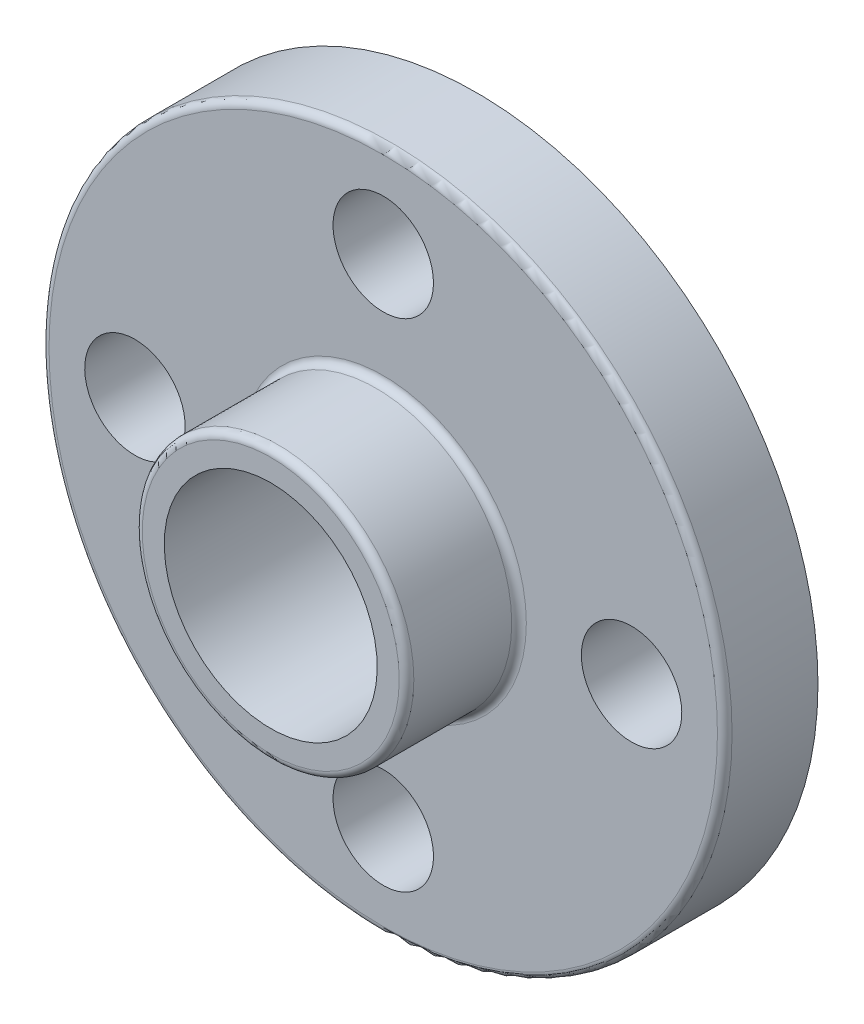
ISO-10303-21;
HEADER;
FILE_DESCRIPTION(('STEP AP214'),'2;1');
FILE_NAME('part.step','',(''),(''),'','','');
FILE_SCHEMA(('AUTOMOTIVE_DESIGN { 1 0 10303 214 1 1 1 1 }'));
ENDSEC;
DATA;
#1=APPLICATION_CONTEXT('core data for automotive mechanical design processes');
#2=APPLICATION_PROTOCOL_DEFINITION('international standard','automotive_design',2000,#1);
#3=PRODUCT_CONTEXT('',#1,'mechanical');
#4=PRODUCT('Part','Part','',(#3));
#5=PRODUCT_RELATED_PRODUCT_CATEGORY('part','',(#4));
#6=PRODUCT_DEFINITION_FORMATION('','',#4);
#7=PRODUCT_DEFINITION_CONTEXT('part definition',#1,'design');
#8=PRODUCT_DEFINITION('design','',#6,#7);
#9=PRODUCT_DEFINITION_SHAPE('','',#8);
#10=(LENGTH_UNIT() NAMED_UNIT(*) SI_UNIT(.MILLI.,.METRE.));
#11=(NAMED_UNIT(*) PLANE_ANGLE_UNIT() SI_UNIT($,.RADIAN.));
#12=(NAMED_UNIT(*) SI_UNIT($,.STERADIAN.) SOLID_ANGLE_UNIT());
#13=UNCERTAINTY_MEASURE_WITH_UNIT(LENGTH_MEASURE(1.E-05),#10,'distance_accuracy_value','');
#14=(GEOMETRIC_REPRESENTATION_CONTEXT(3) GLOBAL_UNCERTAINTY_ASSIGNED_CONTEXT((#13)) GLOBAL_UNIT_ASSIGNED_CONTEXT((#10,
#11,#12)) REPRESENTATION_CONTEXT('',''));
#15=CARTESIAN_POINT('',(0.,0.,0.));
#16=DIRECTION('',(0.,0.,1.));
#17=DIRECTION('',(1.,0.,0.));
#18=AXIS2_PLACEMENT_3D('',#15,#16,#17);
#19=CARTESIAN_POINT('',(0.,0.,14.732));
#20=DIRECTION('',(0.,0.,1.));
#21=DIRECTION('',(1.,0.,0.));
#22=AXIS2_PLACEMENT_3D('',#19,#20,#21);
#23=PLANE('',#22);
#24=CARTESIAN_POINT('',(0.,0.,14.732));
#25=DIRECTION('',(0.,0.,1.));
#26=DIRECTION('',(1.,0.,0.));
#27=AXIS2_PLACEMENT_3D('',#24,#25,#26);
#28=CIRCLE('',#27,22.6175454545454);
#29=CARTESIAN_POINT('',(22.6175454545454,0.,14.732));
#30=VERTEX_POINT('',#29);
#31=EDGE_CURVE('E42',#30,#30,#28,.F.);
#32=ORIENTED_EDGE('',*,*,#31,.T.);
#33=EDGE_LOOP('',(#32));
#34=FACE_BOUND('',#33,.T.);
#35=CARTESIAN_POINT('',(0.,0.,14.732));
#36=DIRECTION('',(0.,0.,1.));
#37=DIRECTION('',(1.,0.,0.));
#38=AXIS2_PLACEMENT_3D('',#35,#36,#37);
#39=CIRCLE('',#38,52.8204545454545);
#40=CARTESIAN_POINT('',(52.8204545454545,0.,14.732));
#41=VERTEX_POINT('',#40);
#42=EDGE_CURVE('E46',#41,#41,#39,.T.);
#43=ORIENTED_EDGE('',*,*,#42,.T.);
#44=EDGE_LOOP('',(#43));
#45=FACE_BOUND('',#44,.T.);
#46=CARTESIAN_POINT('',(39.243,4.11048606540663E-13,14.732));
#47=DIRECTION('',(0.,0.,1.));
#48=DIRECTION('',(0.,-1.,0.));
#49=AXIS2_PLACEMENT_3D('',#46,#47,#48);
#50=CIRCLE('',#49,7.9375);
#51=CARTESIAN_POINT('',(39.2430000000001,-7.93749999999959,14.732));
#52=VERTEX_POINT('',#51);
#53=EDGE_CURVE('E83',#52,#52,#50,.T.);
#54=ORIENTED_EDGE('',*,*,#53,.F.);
#55=EDGE_LOOP('',(#54));
#56=FACE_BOUND('',#55,.T.);
#57=CARTESIAN_POINT('',(2.74032404360442E-13,-39.243,14.732));
#58=DIRECTION('',(0.,0.,1.));
#59=DIRECTION('',(-1.,0.,0.));
#60=AXIS2_PLACEMENT_3D('',#57,#58,#59);
#61=CIRCLE('',#60,7.9375);
#62=CARTESIAN_POINT('',(-7.93749999999973,-39.2430000000001,14.732));
#63=VERTEX_POINT('',#62);
#64=EDGE_CURVE('E77',#63,#63,#61,.T.);
#65=ORIENTED_EDGE('',*,*,#64,.F.);
#66=EDGE_LOOP('',(#65));
#67=FACE_BOUND('',#66,.T.);
#68=CARTESIAN_POINT('',(-39.243,-1.37016202180221E-13,14.732));
#69=DIRECTION('',(0.,0.,1.));
#70=DIRECTION('',(0.,1.,0.));
#71=AXIS2_PLACEMENT_3D('',#68,#69,#70);
#72=CIRCLE('',#71,7.9375);
#73=CARTESIAN_POINT('',(-39.243,7.93749999999986,14.732));
#74=VERTEX_POINT('',#73);
#75=EDGE_CURVE('E71',#74,#74,#72,.T.);
#76=ORIENTED_EDGE('',*,*,#75,.F.);
#77=EDGE_LOOP('',(#76));
#78=FACE_BOUND('',#77,.T.);
#79=CARTESIAN_POINT('',(0.,39.243,14.732));
#80=DIRECTION('',(0.,0.,1.));
#81=DIRECTION('',(1.,0.,0.));
#82=AXIS2_PLACEMENT_3D('',#79,#80,#81);
#83=CIRCLE('',#82,7.9375);
#84=CARTESIAN_POINT('',(7.9375,39.243,14.732));
#85=VERTEX_POINT('',#84);
#86=EDGE_CURVE('E65',#85,#85,#83,.T.);
#87=ORIENTED_EDGE('',*,*,#86,.F.);
#88=EDGE_LOOP('',(#87));
#89=FACE_BOUND('',#88,.T.);
#90=ADVANCED_FACE('F35',(#34,#45,#56,#67,#78,#89),#23,.T.);
#91=CARTESIAN_POINT('',(0.,0.,14.732));
#92=DIRECTION('',(0.,0.,-1.));
#93=DIRECTION('',(-1.,0.,0.));
#94=AXIS2_PLACEMENT_3D('',#91,#92,#93);
#95=CYLINDRICAL_SURFACE('',#94,53.975);
#96=CARTESIAN_POINT('',(0.,0.,13.5774545454545));
#97=DIRECTION('',(0.,0.,1.));
#98=DIRECTION('',(1.,0.,0.));
#99=AXIS2_PLACEMENT_3D('',#96,#97,#98);
#100=CIRCLE('',#99,53.975);
#101=CARTESIAN_POINT('',(53.975,0.,13.5774545454545));
#102=VERTEX_POINT('',#101);
#103=EDGE_CURVE('E10',#102,#102,#100,.F.);
#104=ORIENTED_EDGE('',*,*,#103,.T.);
#105=EDGE_LOOP('',(#104));
#106=FACE_BOUND('',#105,.T.);
#107=CARTESIAN_POINT('',(0.,0.,0.));
#108=DIRECTION('',(0.,0.,1.));
#109=DIRECTION('',(1.,0.,0.));
#110=AXIS2_PLACEMENT_3D('',#107,#108,#109);
#111=CIRCLE('',#110,53.975);
#112=CARTESIAN_POINT('',(53.975,0.,0.));
#113=VERTEX_POINT('',#112);
#114=EDGE_CURVE('E61',#113,#113,#111,.T.);
#115=ORIENTED_EDGE('',*,*,#114,.T.);
#116=EDGE_LOOP('',(#115));
#117=FACE_BOUND('',#116,.T.);
#118=ADVANCED_FACE('F107',(#106,#117),#95,.T.);
#119=CARTESIAN_POINT('',(0.,0.,0.));
#120=DIRECTION('',(0.,0.,1.));
#121=DIRECTION('',(1.,0.,0.));
#122=AXIS2_PLACEMENT_3D('',#119,#120,#121);
#123=PLANE('',#122);
#124=CARTESIAN_POINT('',(0.,0.,0.));
#125=DIRECTION('',(0.,0.,-1.));
#126=DIRECTION('',(0.,1.,0.));
#127=AXIS2_PLACEMENT_3D('',#124,#125,#126);
#128=CIRCLE('',#127,12.1539);
#129=CARTESIAN_POINT('',(0.,12.1539,0.));
#130=VERTEX_POINT('',#129);
#131=EDGE_CURVE('E97',#130,#130,#128,.T.);
#132=ORIENTED_EDGE('',*,*,#131,.F.);
#133=EDGE_LOOP('',(#132));
#134=FACE_BOUND('',#133,.T.);
#135=CARTESIAN_POINT('',(39.243,4.11048606540663E-13,0.));
#136=DIRECTION('',(0.,0.,1.));
#137=DIRECTION('',(0.,-1.,0.));
#138=AXIS2_PLACEMENT_3D('',#135,#136,#137);
#139=CIRCLE('',#138,7.9375);
#140=CARTESIAN_POINT('',(39.2430000000001,-7.93749999999959,0.));
#141=VERTEX_POINT('',#140);
#142=EDGE_CURVE('E80',#141,#141,#139,.T.);
#143=ORIENTED_EDGE('',*,*,#142,.T.);
#144=EDGE_LOOP('',(#143));
#145=FACE_BOUND('',#144,.T.);
#146=CARTESIAN_POINT('',(2.74032404360442E-13,-39.243,0.));
#147=DIRECTION('',(0.,0.,1.));
#148=DIRECTION('',(-1.,0.,0.));
#149=AXIS2_PLACEMENT_3D('',#146,#147,#148);
#150=CIRCLE('',#149,7.9375);
#151=CARTESIAN_POINT('',(-7.93749999999973,-39.2430000000001,0.));
#152=VERTEX_POINT('',#151);
#153=EDGE_CURVE('E74',#152,#152,#150,.T.);
#154=ORIENTED_EDGE('',*,*,#153,.T.);
#155=EDGE_LOOP('',(#154));
#156=FACE_BOUND('',#155,.T.);
#157=CARTESIAN_POINT('',(-39.243,-1.37016202180221E-13,0.));
#158=DIRECTION('',(0.,0.,1.));
#159=DIRECTION('',(0.,1.,0.));
#160=AXIS2_PLACEMENT_3D('',#157,#158,#159);
#161=CIRCLE('',#160,7.9375);
#162=CARTESIAN_POINT('',(-39.243,7.93749999999986,0.));
#163=VERTEX_POINT('',#162);
#164=EDGE_CURVE('E68',#163,#163,#161,.T.);
#165=ORIENTED_EDGE('',*,*,#164,.T.);
#166=EDGE_LOOP('',(#165));
#167=FACE_BOUND('',#166,.T.);
#168=CARTESIAN_POINT('',(0.,39.243,0.));
#169=DIRECTION('',(0.,0.,1.));
#170=DIRECTION('',(1.,0.,0.));
#171=AXIS2_PLACEMENT_3D('',#168,#169,#170);
#172=CIRCLE('',#171,7.9375);
#173=CARTESIAN_POINT('',(7.9375,39.243,0.));
#174=VERTEX_POINT('',#173);
#175=EDGE_CURVE('E64',#174,#174,#172,.T.);
#176=ORIENTED_EDGE('',*,*,#175,.T.);
#177=EDGE_LOOP('',(#176));
#178=FACE_BOUND('',#177,.T.);
#179=ORIENTED_EDGE('',*,*,#114,.F.);
#180=EDGE_LOOP('',(#179));
#181=FACE_BOUND('',#180,.T.);
#182=ADVANCED_FACE('F103',(#134,#145,#156,#167,#178,#181),#123,.F.);
#183=CARTESIAN_POINT('',(0.,0.,32.512));
#184=DIRECTION('',(0.,0.,-1.));
#185=DIRECTION('',(-1.,0.,0.));
#186=AXIS2_PLACEMENT_3D('',#183,#184,#185);
#187=CYLINDRICAL_SURFACE('',#186,21.463);
#188=CARTESIAN_POINT('',(0.,0.,31.3574545454545));
#189=DIRECTION('',(0.,0.,1.));
#190=DIRECTION('',(1.,0.,0.));
#191=AXIS2_PLACEMENT_3D('',#188,#189,#190);
#192=CIRCLE('',#191,21.463);
#193=CARTESIAN_POINT('',(-21.463,0.,31.3574545454545));
#194=VERTEX_POINT('',#193);
#195=EDGE_CURVE('E50',#194,#194,#192,.F.);
#196=CARTESIAN_POINT('',(0.,0.,15.8865454545455));
#197=DIRECTION('',(0.,0.,1.));
#198=DIRECTION('',(1.,0.,0.));
#199=AXIS2_PLACEMENT_3D('',#196,#197,#198);
#200=CIRCLE('',#199,21.463);
#201=CARTESIAN_POINT('',(-21.463,0.,15.8865454545454));
#202=VERTEX_POINT('',#201);
#203=EDGE_CURVE('E55',#202,#202,#200,.T.);
#204=CARTESIAN_POINT('',(-21.463,0.,31.3574545454545));
#205=CARTESIAN_POINT('',(-21.463,0.,31.1962992424242));
#206=CARTESIAN_POINT('',(-21.463,0.,31.0351439393939));
#207=CARTESIAN_POINT('',(-21.463,0.,30.7128333333333));
#208=CARTESIAN_POINT('',(-21.463,0.,30.551678030303));
#209=CARTESIAN_POINT('',(-21.463,0.,30.2293674242424));
#210=CARTESIAN_POINT('',(-21.463,0.,30.0682121212121));
#211=CARTESIAN_POINT('',(-21.463,0.,29.7459015151515));
#212=CARTESIAN_POINT('',(-21.463,0.,29.5847462121212));
#213=CARTESIAN_POINT('',(-21.463,0.,29.2624356060606));
#214=CARTESIAN_POINT('',(-21.463,0.,29.1012803030303));
#215=CARTESIAN_POINT('',(-21.463,0.,28.7789696969697));
#216=CARTESIAN_POINT('',(-21.463,0.,28.6178143939394));
#217=CARTESIAN_POINT('',(-21.463,0.,28.2955037878788));
#218=CARTESIAN_POINT('',(-21.463,0.,28.1343484848485));
#219=CARTESIAN_POINT('',(-21.463,0.,27.8120378787879));
#220=CARTESIAN_POINT('',(-21.463,0.,27.6508825757576));
#221=CARTESIAN_POINT('',(-21.463,0.,27.328571969697));
#222=CARTESIAN_POINT('',(-21.463,0.,27.1674166666667));
#223=CARTESIAN_POINT('',(-21.463,0.,26.8451060606061));
#224=CARTESIAN_POINT('',(-21.463,0.,26.6839507575758));
#225=CARTESIAN_POINT('',(-21.463,0.,26.3616401515151));
#226=CARTESIAN_POINT('',(-21.463,0.,26.2004848484848));
#227=CARTESIAN_POINT('',(-21.463,0.,25.8781742424242));
#228=CARTESIAN_POINT('',(-21.463,0.,25.7170189393939));
#229=CARTESIAN_POINT('',(-21.463,0.,25.3947083333333));
#230=CARTESIAN_POINT('',(-21.463,0.,25.233553030303));
#231=CARTESIAN_POINT('',(-21.463,0.,24.9112424242424));
#232=CARTESIAN_POINT('',(-21.463,0.,24.7500871212121));
#233=CARTESIAN_POINT('',(-21.463,0.,24.4277765151515));
#234=CARTESIAN_POINT('',(-21.463,0.,24.2666212121212));
#235=CARTESIAN_POINT('',(-21.463,0.,23.9443106060606));
#236=CARTESIAN_POINT('',(-21.463,0.,23.7831553030303));
#237=CARTESIAN_POINT('',(-21.463,0.,23.4608446969697));
#238=CARTESIAN_POINT('',(-21.463,0.,23.2996893939394));
#239=CARTESIAN_POINT('',(-21.463,0.,22.9773787878788));
#240=CARTESIAN_POINT('',(-21.463,0.,22.8162234848485));
#241=CARTESIAN_POINT('',(-21.463,0.,22.4939128787879));
#242=CARTESIAN_POINT('',(-21.463,0.,22.3327575757576));
#243=CARTESIAN_POINT('',(-21.463,0.,22.010446969697));
#244=CARTESIAN_POINT('',(-21.463,0.,21.8492916666667));
#245=CARTESIAN_POINT('',(-21.463,0.,21.5269810606061));
#246=CARTESIAN_POINT('',(-21.463,0.,21.3658257575757));
#247=CARTESIAN_POINT('',(-21.463,0.,21.0435151515151));
#248=CARTESIAN_POINT('',(-21.463,0.,20.8823598484848));
#249=CARTESIAN_POINT('',(-21.463,0.,20.5600492424242));
#250=CARTESIAN_POINT('',(-21.463,0.,20.3988939393939));
#251=CARTESIAN_POINT('',(-21.463,0.,20.0765833333333));
#252=CARTESIAN_POINT('',(-21.463,0.,19.915428030303));
#253=CARTESIAN_POINT('',(-21.463,0.,19.5931174242424));
#254=CARTESIAN_POINT('',(-21.463,0.,19.4319621212121));
#255=CARTESIAN_POINT('',(-21.463,0.,19.1096515151515));
#256=CARTESIAN_POINT('',(-21.463,0.,18.9484962121212));
#257=CARTESIAN_POINT('',(-21.463,0.,18.6261856060606));
#258=CARTESIAN_POINT('',(-21.463,0.,18.4650303030303));
#259=CARTESIAN_POINT('',(-21.463,0.,18.1427196969697));
#260=CARTESIAN_POINT('',(-21.463,0.,17.9815643939394));
#261=CARTESIAN_POINT('',(-21.463,0.,17.6592537878788));
#262=CARTESIAN_POINT('',(-21.463,0.,17.4980984848485));
#263=CARTESIAN_POINT('',(-21.463,0.,17.1757878787879));
#264=CARTESIAN_POINT('',(-21.463,0.,17.0146325757576));
#265=CARTESIAN_POINT('',(-21.463,0.,16.692321969697));
#266=CARTESIAN_POINT('',(-21.463,0.,16.5311666666667));
#267=CARTESIAN_POINT('',(-21.463,0.,16.2088560606061));
#268=CARTESIAN_POINT('',(-21.463,0.,16.0477007575758));
#269=CARTESIAN_POINT('',(-21.463,0.,15.8865454545454));
#270=B_SPLINE_CURVE_WITH_KNOTS('',3,(#204,#205,#206,#207,#208,#209,#210,#211,#212,#213,#214,
#215,#216,#217,#218,#219,#220,#221,#222,#223,#224,#225,#226,#227,#228,#229,#230,#231,#232,#233,
#234,#235,#236,#237,#238,#239,#240,#241,#242,#243,#244,#245,#246,#247,#248,#249,#250,#251,#252,
#253,#254,#255,#256,#257,#258,#259,#260,#261,#262,#263,#264,#265,#266,#267,#268,#269),
.UNSPECIFIED.,.F.,.F.,(4,2,2,2,2,2,2,2,2,2,2,2,2,2,2,2,2,2,2,2,2,2,2,2,2,2,2,2,2,2,2,2,4),(0.,
0.483465909090913,0.966931818181822,1.45039772727273,1.93386363636364,2.41732954545455,
2.90079545454546,3.38426136363637,3.86772727272728,4.35119318181818,4.83465909090909,5.318125,
5.80159090909091,6.28505681818182,6.76852272727273,7.25198863636364,7.73545454545455,
8.21892045454546,8.70238636363637,9.18585227272728,9.66931818181819,10.1527840909091,10.63625,
11.1197159090909,11.6031818181818,12.0866477272727,12.5701136363636,13.0535795454546,
13.5370454545455,14.0205113636364,14.5039772727273,14.9874431818182,15.4709090909091),.UNSPECIFIED.);
#271=EDGE_CURVE('BSEAM106',#194,#202,#270,.T.);
#272=ORIENTED_EDGE('',*,*,#195,.T.);
#273=ORIENTED_EDGE('',*,*,#203,.T.);
#274=ORIENTED_EDGE('',*,*,#271,.T.);
#275=ORIENTED_EDGE('',*,*,#271,.F.);
#276=EDGE_LOOP('',(#272,#274,#273,#275));
#277=FACE_BOUND('',#276,.T.);
#278=ADVANCED_FACE('F106',(#277),#187,.T.);
#279=CARTESIAN_POINT('',(0.,0.,32.512));
#280=DIRECTION('',(0.,0.,1.));
#281=DIRECTION('',(1.,0.,0.));
#282=AXIS2_PLACEMENT_3D('',#279,#280,#281);
#283=PLANE('',#282);
#284=CARTESIAN_POINT('',(0.,0.,32.512));
#285=DIRECTION('',(0.,0.,-1.));
#286=DIRECTION('',(0.,1.,0.));
#287=AXIS2_PLACEMENT_3D('',#284,#285,#286);
#288=CIRCLE('',#287,16.8275);
#289=CARTESIAN_POINT('',(0.,16.8275,32.512));
#290=VERTEX_POINT('',#289);
#291=EDGE_CURVE('E86',#290,#290,#288,.T.);
#292=ORIENTED_EDGE('',*,*,#291,.T.);
#293=EDGE_LOOP('',(#292));
#294=FACE_BOUND('',#293,.T.);
#295=CARTESIAN_POINT('',(0.,0.,32.512));
#296=DIRECTION('',(0.,0.,1.));
#297=DIRECTION('',(1.,0.,0.));
#298=AXIS2_PLACEMENT_3D('',#295,#296,#297);
#299=CIRCLE('',#298,20.3084545454545);
#300=CARTESIAN_POINT('',(20.3084545454545,0.,32.512));
#301=VERTEX_POINT('',#300);
#302=EDGE_CURVE('E58',#301,#301,#299,.T.);
#303=ORIENTED_EDGE('',*,*,#302,.T.);
#304=EDGE_LOOP('',(#303));
#305=FACE_BOUND('',#304,.T.);
#306=ADVANCED_FACE('F142',(#294,#305),#283,.T.);
#307=CARTESIAN_POINT('',(0.,39.243,0.));
#308=DIRECTION('',(0.,0.,1.));
#309=DIRECTION('',(1.,0.,0.));
#310=AXIS2_PLACEMENT_3D('',#307,#308,#309);
#311=CYLINDRICAL_SURFACE('',#310,7.9375);
#312=ORIENTED_EDGE('',*,*,#175,.F.);
#313=EDGE_LOOP('',(#312));
#314=FACE_BOUND('',#313,.T.);
#315=ORIENTED_EDGE('',*,*,#86,.T.);
#316=EDGE_LOOP('',(#315));
#317=FACE_BOUND('',#316,.T.);
#318=ADVANCED_FACE('F148',(#314,#317),#311,.F.);
#319=CARTESIAN_POINT('',(-39.243,-1.37016202180221E-13,0.));
#320=DIRECTION('',(0.,0.,1.));
#321=DIRECTION('',(1.,0.,0.));
#322=AXIS2_PLACEMENT_3D('',#319,#320,#321);
#323=CYLINDRICAL_SURFACE('',#322,7.9375);
#324=ORIENTED_EDGE('',*,*,#164,.F.);
#325=EDGE_LOOP('',(#324));
#326=FACE_BOUND('',#325,.T.);
#327=ORIENTED_EDGE('',*,*,#75,.T.);
#328=EDGE_LOOP('',(#327));
#329=FACE_BOUND('',#328,.T.);
#330=ADVANCED_FACE('F154',(#326,#329),#323,.F.);
#331=CARTESIAN_POINT('',(2.74032404360442E-13,-39.243,0.));
#332=DIRECTION('',(0.,0.,1.));
#333=DIRECTION('',(1.,0.,0.));
#334=AXIS2_PLACEMENT_3D('',#331,#332,#333);
#335=CYLINDRICAL_SURFACE('',#334,7.9375);
#336=ORIENTED_EDGE('',*,*,#153,.F.);
#337=EDGE_LOOP('',(#336));
#338=FACE_BOUND('',#337,.T.);
#339=ORIENTED_EDGE('',*,*,#64,.T.);
#340=EDGE_LOOP('',(#339));
#341=FACE_BOUND('',#340,.T.);
#342=ADVANCED_FACE('F158',(#338,#341),#335,.F.);
#343=CARTESIAN_POINT('',(39.243,4.11048606540663E-13,0.));
#344=DIRECTION('',(0.,0.,1.));
#345=DIRECTION('',(1.,0.,0.));
#346=AXIS2_PLACEMENT_3D('',#343,#344,#345);
#347=CYLINDRICAL_SURFACE('',#346,7.9375);
#348=ORIENTED_EDGE('',*,*,#142,.F.);
#349=EDGE_LOOP('',(#348));
#350=FACE_BOUND('',#349,.T.);
#351=ORIENTED_EDGE('',*,*,#53,.T.);
#352=EDGE_LOOP('',(#351));
#353=FACE_BOUND('',#352,.T.);
#354=ADVANCED_FACE('F129',(#350,#353),#347,.F.);
#355=CARTESIAN_POINT('',(0.,0.,31.3574545454545));
#356=DIRECTION('',(0.,0.,1.));
#357=DIRECTION('',(1.,0.,0.));
#358=AXIS2_PLACEMENT_3D('',#355,#356,#357);
#359=TOROIDAL_SURFACE('',#358,20.3084545454545,1.15454545454545);
#360=ORIENTED_EDGE('',*,*,#195,.F.);
#361=EDGE_LOOP('',(#360));
#362=FACE_BOUND('',#361,.T.);
#363=ORIENTED_EDGE('',*,*,#302,.F.);
#364=EDGE_LOOP('',(#363));
#365=FACE_BOUND('',#364,.T.);
#366=ADVANCED_FACE('F126',(#362,#365),#359,.T.);
#367=CARTESIAN_POINT('',(0.,0.,15.8865454545455));
#368=DIRECTION('',(0.,0.,1.));
#369=DIRECTION('',(1.,0.,0.));
#370=AXIS2_PLACEMENT_3D('',#367,#368,#369);
#371=TOROIDAL_SURFACE('',#370,22.6175454545454,1.15454545454545);
#372=ORIENTED_EDGE('',*,*,#31,.F.);
#373=EDGE_LOOP('',(#372));
#374=FACE_BOUND('',#373,.T.);
#375=ORIENTED_EDGE('',*,*,#203,.F.);
#376=EDGE_LOOP('',(#375));
#377=FACE_BOUND('',#376,.T.);
#378=ADVANCED_FACE('F128',(#374,#377),#371,.F.);
#379=CARTESIAN_POINT('',(0.,0.,13.5774545454545));
#380=DIRECTION('',(0.,0.,1.));
#381=DIRECTION('',(1.,0.,0.));
#382=AXIS2_PLACEMENT_3D('',#379,#380,#381);
#383=TOROIDAL_SURFACE('',#382,52.8204545454545,1.15454545454545);
#384=ORIENTED_EDGE('',*,*,#103,.F.);
#385=EDGE_LOOP('',(#384));
#386=FACE_BOUND('',#385,.T.);
#387=ORIENTED_EDGE('',*,*,#42,.F.);
#388=EDGE_LOOP('',(#387));
#389=FACE_BOUND('',#388,.T.);
#390=ADVANCED_FACE('F37',(#386,#389),#383,.T.);
#391=CARTESIAN_POINT('',(0.,0.,4.06399999999998));
#392=DIRECTION('',(0.,0.,1.));
#393=DIRECTION('',(0.,-1.,0.));
#394=AXIS2_PLACEMENT_3D('',#391,#392,#393);
#395=CONICAL_SURFACE('',#394,16.637,0.00669632848002418);
#396=ORIENTED_EDGE('',*,*,#291,.F.);
#397=EDGE_LOOP('',(#396));
#398=FACE_BOUND('',#397,.T.);
#399=CARTESIAN_POINT('',(0.,0.,4.06399999999998));
#400=DIRECTION('',(0.,0.,-1.));
#401=DIRECTION('',(0.,1.,0.));
#402=AXIS2_PLACEMENT_3D('',#399,#400,#401);
#403=CIRCLE('',#402,16.637);
#404=CARTESIAN_POINT('',(0.,16.637,4.06399999999998));
#405=VERTEX_POINT('',#404);
#406=EDGE_CURVE('E91',#405,#405,#403,.T.);
#407=ORIENTED_EDGE('',*,*,#406,.T.);
#408=EDGE_LOOP('',(#407));
#409=FACE_BOUND('',#408,.T.);
#410=ADVANCED_FACE('F136',(#398,#409),#395,.F.);
#411=CARTESIAN_POINT('',(0.,16.637,4.06399999999999));
#412=DIRECTION('',(0.,0.,-1.));
#413=DIRECTION('',(0.,1.,0.));
#414=AXIS2_PLACEMENT_3D('',#411,#412,#413);
#415=PLANE('',#414);
#416=ORIENTED_EDGE('',*,*,#406,.F.);
#417=EDGE_LOOP('',(#416));
#418=FACE_BOUND('',#417,.T.);
#419=CARTESIAN_POINT('',(0.,0.,4.064));
#420=DIRECTION('',(0.,0.,-1.));
#421=DIRECTION('',(0.,1.,0.));
#422=AXIS2_PLACEMENT_3D('',#419,#420,#421);
#423=CIRCLE('',#422,12.1539);
#424=CARTESIAN_POINT('',(0.,12.1539,4.064));
#425=VERTEX_POINT('',#424);
#426=EDGE_CURVE('E94',#425,#425,#423,.T.);
#427=ORIENTED_EDGE('',*,*,#426,.T.);
#428=EDGE_LOOP('',(#427));
#429=FACE_BOUND('',#428,.T.);
#430=ADVANCED_FACE('F168',(#418,#429),#415,.F.);
#431=CARTESIAN_POINT('',(0.,0.,0.));
#432=DIRECTION('',(0.,0.,-1.));
#433=DIRECTION('',(0.,1.,0.));
#434=AXIS2_PLACEMENT_3D('',#431,#432,#433);
#435=CYLINDRICAL_SURFACE('',#434,12.1539);
#436=ORIENTED_EDGE('',*,*,#426,.F.);
#437=EDGE_LOOP('',(#436));
#438=FACE_BOUND('',#437,.T.);
#439=ORIENTED_EDGE('',*,*,#131,.T.);
#440=EDGE_LOOP('',(#439));
#441=FACE_BOUND('',#440,.T.);
#442=ADVANCED_FACE('F101',(#438,#441),#435,.F.);
#443=CLOSED_SHELL('',(#90,#118,#182,#278,#306,#318,#330,#342,#354,#366,#378,#390,#410,#430,#442));
#444=MANIFOLD_SOLID_BREP('B2',#443);
#445=ADVANCED_BREP_SHAPE_REPRESENTATION('',(#18,#444),#14);
#446=SHAPE_DEFINITION_REPRESENTATION(#9,#445);
ENDSEC;
END-ISO-10303-21;
